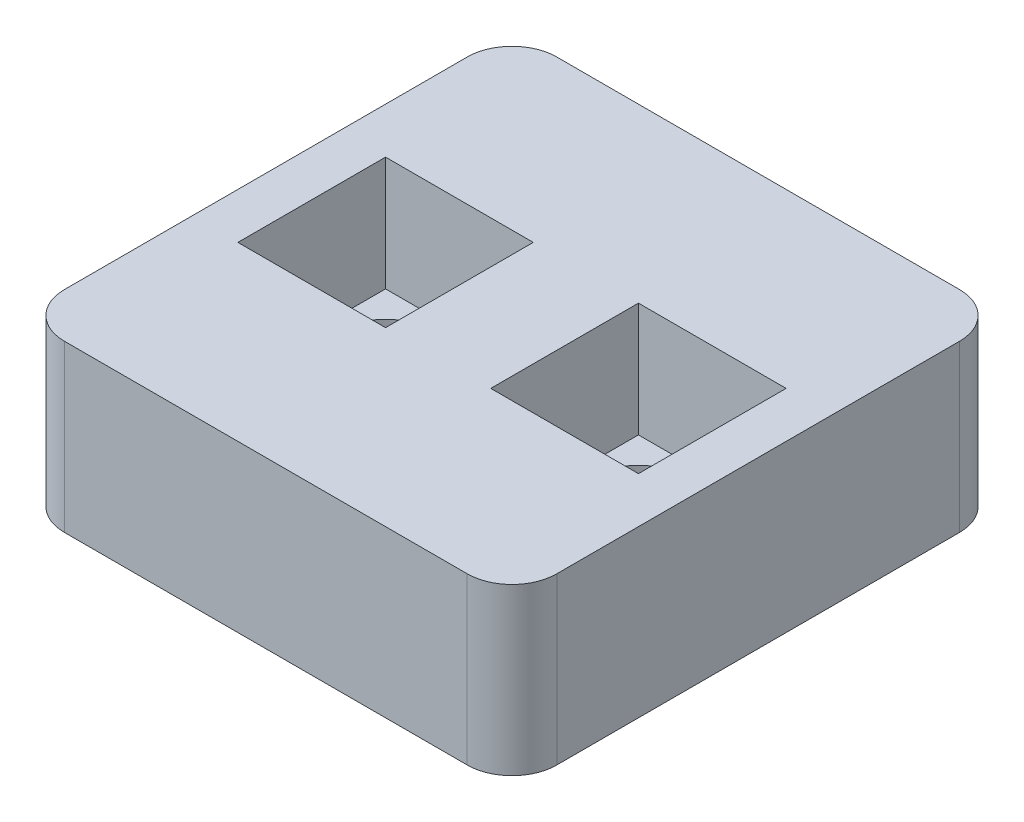
ISO-10303-21;
HEADER;
FILE_DESCRIPTION(('STEP AP214'),'2;1');
FILE_NAME('part.step','',(''),(''),'','','');
FILE_SCHEMA(('AUTOMOTIVE_DESIGN { 1 0 10303 214 1 1 1 1 }'));
ENDSEC;
DATA;
#1=APPLICATION_CONTEXT('core data for automotive mechanical design processes');
#2=APPLICATION_PROTOCOL_DEFINITION('international standard','automotive_design',2000,#1);
#3=PRODUCT_CONTEXT('',#1,'mechanical');
#4=PRODUCT('Part','Part','',(#3));
#5=PRODUCT_RELATED_PRODUCT_CATEGORY('part','',(#4));
#6=PRODUCT_DEFINITION_FORMATION('','',#4);
#7=PRODUCT_DEFINITION_CONTEXT('part definition',#1,'design');
#8=PRODUCT_DEFINITION('design','',#6,#7);
#9=PRODUCT_DEFINITION_SHAPE('','',#8);
#10=(LENGTH_UNIT() NAMED_UNIT(*) SI_UNIT(.MILLI.,.METRE.));
#11=(NAMED_UNIT(*) PLANE_ANGLE_UNIT() SI_UNIT($,.RADIAN.));
#12=(NAMED_UNIT(*) SI_UNIT($,.STERADIAN.) SOLID_ANGLE_UNIT());
#13=UNCERTAINTY_MEASURE_WITH_UNIT(LENGTH_MEASURE(1.E-05),#10,'distance_accuracy_value','');
#14=(GEOMETRIC_REPRESENTATION_CONTEXT(3) GLOBAL_UNCERTAINTY_ASSIGNED_CONTEXT((#13)) GLOBAL_UNIT_ASSIGNED_CONTEXT((#10,
#11,#12)) REPRESENTATION_CONTEXT('',''));
#15=CARTESIAN_POINT('',(0.,0.,0.));
#16=DIRECTION('',(0.,0.,1.));
#17=DIRECTION('',(1.,0.,0.));
#18=AXIS2_PLACEMENT_3D('',#15,#16,#17);
#19=CARTESIAN_POINT('',(5.5,3.7,5.5));
#20=DIRECTION('',(-1.,0.,0.));
#21=DIRECTION('',(0.,0.,1.));
#22=AXIS2_PLACEMENT_3D('',#19,#20,#21);
#23=PLANE('',#22);
#24=DIRECTION('',(0.,0.,-1.));
#25=VECTOR('',#24,1.);
#26=CARTESIAN_POINT('',(5.5,0.,5.5));
#27=LINE('',#26,#25);
#28=CARTESIAN_POINT('',(5.5,0.,4.5));
#29=VERTEX_POINT('',#28);
#30=CARTESIAN_POINT('',(5.5,0.,-4.5));
#31=VERTEX_POINT('',#30);
#32=EDGE_CURVE('E208',#29,#31,#27,.T.);
#33=ORIENTED_EDGE('',*,*,#32,.T.);
#34=DIRECTION('',(0.,-1.,0.));
#35=VECTOR('',#34,1.);
#36=CARTESIAN_POINT('',(5.5,3.7,-4.5));
#37=LINE('',#36,#35);
#38=CARTESIAN_POINT('',(5.5,3.7,-4.5));
#39=VERTEX_POINT('',#38);
#40=EDGE_CURVE('E11',#31,#39,#37,.F.);
#41=ORIENTED_EDGE('',*,*,#40,.T.);
#42=DIRECTION('',(0.,0.,-1.));
#43=VECTOR('',#42,1.);
#44=CARTESIAN_POINT('',(5.5,3.7,5.5));
#45=LINE('',#44,#43);
#46=CARTESIAN_POINT('',(5.5,3.7,4.5));
#47=VERTEX_POINT('',#46);
#48=EDGE_CURVE('E256',#47,#39,#45,.T.);
#49=ORIENTED_EDGE('',*,*,#48,.F.);
#50=DIRECTION('',(0.,-1.,0.));
#51=VECTOR('',#50,1.);
#52=CARTESIAN_POINT('',(5.5,3.7,4.5));
#53=LINE('',#52,#51);
#54=EDGE_CURVE('E55',#47,#29,#53,.T.);
#55=ORIENTED_EDGE('',*,*,#54,.T.);
#56=EDGE_LOOP('',(#33,#41,#49,#55));
#57=FACE_BOUND('',#56,.T.);
#58=ADVANCED_FACE('F45',(#57),#23,.F.);
#59=CARTESIAN_POINT('',(-5.5,3.7,-5.5));
#60=DIRECTION('',(0.,0.,1.));
#61=DIRECTION('',(1.,0.,0.));
#62=AXIS2_PLACEMENT_3D('',#59,#60,#61);
#63=PLANE('',#62);
#64=DIRECTION('',(-1.,0.,0.));
#65=VECTOR('',#64,1.);
#66=CARTESIAN_POINT('',(-5.5,0.,-5.5));
#67=LINE('',#66,#65);
#68=CARTESIAN_POINT('',(4.5,0.,-5.5));
#69=VERTEX_POINT('',#68);
#70=CARTESIAN_POINT('',(-4.5,0.,-5.5));
#71=VERTEX_POINT('',#70);
#72=EDGE_CURVE('E277',#69,#71,#67,.T.);
#73=ORIENTED_EDGE('',*,*,#72,.T.);
#74=DIRECTION('',(0.,-1.,0.));
#75=VECTOR('',#74,1.);
#76=CARTESIAN_POINT('',(-4.5,3.7,-5.5));
#77=LINE('',#76,#75);
#78=CARTESIAN_POINT('',(-4.5,3.7,-5.5));
#79=VERTEX_POINT('',#78);
#80=EDGE_CURVE('E310',#71,#79,#77,.F.);
#81=ORIENTED_EDGE('',*,*,#80,.T.);
#82=DIRECTION('',(-1.,0.,0.));
#83=VECTOR('',#82,1.);
#84=CARTESIAN_POINT('',(-5.5,3.7,-5.5));
#85=LINE('',#84,#83);
#86=CARTESIAN_POINT('',(4.5,3.7,-5.5));
#87=VERTEX_POINT('',#86);
#88=EDGE_CURVE('E260',#87,#79,#85,.T.);
#89=ORIENTED_EDGE('',*,*,#88,.F.);
#90=DIRECTION('',(0.,-1.,0.));
#91=VECTOR('',#90,1.);
#92=CARTESIAN_POINT('',(4.5,3.7,-5.5));
#93=LINE('',#92,#91);
#94=EDGE_CURVE('E306',#87,#69,#93,.T.);
#95=ORIENTED_EDGE('',*,*,#94,.T.);
#96=EDGE_LOOP('',(#73,#81,#89,#95));
#97=FACE_BOUND('',#96,.T.);
#98=ADVANCED_FACE('F417',(#97),#63,.F.);
#99=CARTESIAN_POINT('',(-5.5,3.7,5.5));
#100=DIRECTION('',(1.,0.,0.));
#101=DIRECTION('',(0.,0.,-1.));
#102=AXIS2_PLACEMENT_3D('',#99,#100,#101);
#103=PLANE('',#102);
#104=DIRECTION('',(0.,0.,1.));
#105=VECTOR('',#104,1.);
#106=CARTESIAN_POINT('',(-5.5,3.7,5.5));
#107=LINE('',#106,#105);
#108=CARTESIAN_POINT('',(-5.5,3.7,-4.5));
#109=VERTEX_POINT('',#108);
#110=CARTESIAN_POINT('',(-5.5,3.7,4.5));
#111=VERTEX_POINT('',#110);
#112=EDGE_CURVE('E265',#109,#111,#107,.T.);
#113=ORIENTED_EDGE('',*,*,#112,.F.);
#114=DIRECTION('',(0.,-1.,0.));
#115=VECTOR('',#114,1.);
#116=CARTESIAN_POINT('',(-5.5,3.7,-4.5));
#117=LINE('',#116,#115);
#118=CARTESIAN_POINT('',(-5.5,0.,-4.5));
#119=VERTEX_POINT('',#118);
#120=EDGE_CURVE('E290',#109,#119,#117,.T.);
#121=ORIENTED_EDGE('',*,*,#120,.T.);
#122=DIRECTION('',(0.,0.,1.));
#123=VECTOR('',#122,1.);
#124=CARTESIAN_POINT('',(-5.5,0.,5.5));
#125=LINE('',#124,#123);
#126=CARTESIAN_POINT('',(-5.5,0.,4.5));
#127=VERTEX_POINT('',#126);
#128=EDGE_CURVE('E281',#119,#127,#125,.T.);
#129=ORIENTED_EDGE('',*,*,#128,.T.);
#130=DIRECTION('',(0.,-1.,0.));
#131=VECTOR('',#130,1.);
#132=CARTESIAN_POINT('',(-5.5,3.7,4.5));
#133=LINE('',#132,#131);
#134=EDGE_CURVE('E273',#127,#111,#133,.F.);
#135=ORIENTED_EDGE('',*,*,#134,.T.);
#136=EDGE_LOOP('',(#113,#121,#129,#135));
#137=FACE_BOUND('',#136,.T.);
#138=ADVANCED_FACE('F397',(#137),#103,.F.);
#139=CARTESIAN_POINT('',(-5.5,3.7,5.5));
#140=DIRECTION('',(0.,0.,-1.));
#141=DIRECTION('',(-1.,0.,0.));
#142=AXIS2_PLACEMENT_3D('',#139,#140,#141);
#143=PLANE('',#142);
#144=DIRECTION('',(1.,0.,0.));
#145=VECTOR('',#144,1.);
#146=CARTESIAN_POINT('',(-5.5,3.7,5.5));
#147=LINE('',#146,#145);
#148=CARTESIAN_POINT('',(-4.5,3.7,5.5));
#149=VERTEX_POINT('',#148);
#150=CARTESIAN_POINT('',(4.5,3.7,5.5));
#151=VERTEX_POINT('',#150);
#152=EDGE_CURVE('E269',#149,#151,#147,.T.);
#153=ORIENTED_EDGE('',*,*,#152,.F.);
#154=DIRECTION('',(0.,-1.,0.));
#155=VECTOR('',#154,1.);
#156=CARTESIAN_POINT('',(-4.5,3.7,5.5));
#157=LINE('',#156,#155);
#158=CARTESIAN_POINT('',(-4.5,0.,5.5));
#159=VERTEX_POINT('',#158);
#160=EDGE_CURVE('E328',#149,#159,#157,.T.);
#161=ORIENTED_EDGE('',*,*,#160,.T.);
#162=DIRECTION('',(1.,0.,0.));
#163=VECTOR('',#162,1.);
#164=CARTESIAN_POINT('',(-5.5,0.,5.5));
#165=LINE('',#164,#163);
#166=CARTESIAN_POINT('',(4.5,0.,5.5));
#167=VERTEX_POINT('',#166);
#168=EDGE_CURVE('E261',#159,#167,#165,.T.);
#169=ORIENTED_EDGE('',*,*,#168,.T.);
#170=DIRECTION('',(0.,-1.,0.));
#171=VECTOR('',#170,1.);
#172=CARTESIAN_POINT('',(4.5,3.7,5.5));
#173=LINE('',#172,#171);
#174=EDGE_CURVE('E325',#167,#151,#173,.F.);
#175=ORIENTED_EDGE('',*,*,#174,.T.);
#176=EDGE_LOOP('',(#153,#161,#169,#175));
#177=FACE_BOUND('',#176,.T.);
#178=ADVANCED_FACE('F382',(#177),#143,.F.);
#179=CARTESIAN_POINT('',(0.,3.7,0.));
#180=DIRECTION('',(0.,-1.,0.));
#181=DIRECTION('',(0.,0.,-1.));
#182=AXIS2_PLACEMENT_3D('',#179,#180,#181);
#183=PLANE('',#182);
#184=DIRECTION('',(-1.,0.,0.));
#185=VECTOR('',#184,1.);
#186=CARTESIAN_POINT('',(-4.475,3.7,-1.65));
#187=LINE('',#186,#185);
#188=CARTESIAN_POINT('',(-1.175,3.7,-1.65));
#189=VERTEX_POINT('',#188);
#190=CARTESIAN_POINT('',(-4.475,3.7,-1.65));
#191=VERTEX_POINT('',#190);
#192=EDGE_CURVE('E199',#189,#191,#187,.T.);
#193=ORIENTED_EDGE('',*,*,#192,.F.);
#194=DIRECTION('',(0.,0.,-1.));
#195=VECTOR('',#194,1.);
#196=CARTESIAN_POINT('',(-1.175,3.7,1.65));
#197=LINE('',#196,#195);
#198=CARTESIAN_POINT('',(-1.175,3.7,1.65));
#199=VERTEX_POINT('',#198);
#200=EDGE_CURVE('E63',#199,#189,#197,.T.);
#201=ORIENTED_EDGE('',*,*,#200,.F.);
#202=DIRECTION('',(1.,0.,0.));
#203=VECTOR('',#202,1.);
#204=CARTESIAN_POINT('',(-4.475,3.7,1.65));
#205=LINE('',#204,#203);
#206=CARTESIAN_POINT('',(-4.475,3.7,1.65));
#207=VERTEX_POINT('',#206);
#208=EDGE_CURVE('E183',#207,#199,#205,.T.);
#209=ORIENTED_EDGE('',*,*,#208,.F.);
#210=DIRECTION('',(0.,0.,1.));
#211=VECTOR('',#210,1.);
#212=CARTESIAN_POINT('',(-4.475,3.7,1.65));
#213=LINE('',#212,#211);
#214=EDGE_CURVE('E187',#191,#207,#213,.T.);
#215=ORIENTED_EDGE('',*,*,#214,.F.);
#216=EDGE_LOOP('',(#193,#201,#209,#215));
#217=FACE_BOUND('',#216,.T.);
#218=DIRECTION('',(-1.,0.,0.));
#219=VECTOR('',#218,1.);
#220=CARTESIAN_POINT('',(1.175,3.7,-1.65));
#221=LINE('',#220,#219);
#222=CARTESIAN_POINT('',(4.475,3.7,-1.65));
#223=VERTEX_POINT('',#222);
#224=CARTESIAN_POINT('',(1.175,3.7,-1.65));
#225=VERTEX_POINT('',#224);
#226=EDGE_CURVE('E236',#223,#225,#221,.T.);
#227=ORIENTED_EDGE('',*,*,#226,.F.);
#228=DIRECTION('',(0.,0.,-1.));
#229=VECTOR('',#228,1.);
#230=CARTESIAN_POINT('',(4.475,3.7,1.65));
#231=LINE('',#230,#229);
#232=CARTESIAN_POINT('',(4.475,3.7,1.65));
#233=VERTEX_POINT('',#232);
#234=EDGE_CURVE('E71',#233,#223,#231,.T.);
#235=ORIENTED_EDGE('',*,*,#234,.F.);
#236=DIRECTION('',(1.,0.,0.));
#237=VECTOR('',#236,1.);
#238=CARTESIAN_POINT('',(1.175,3.7,1.65));
#239=LINE('',#238,#237);
#240=CARTESIAN_POINT('',(1.175,3.7,1.65));
#241=VERTEX_POINT('',#240);
#242=EDGE_CURVE('E227',#241,#233,#239,.T.);
#243=ORIENTED_EDGE('',*,*,#242,.F.);
#244=DIRECTION('',(0.,0.,1.));
#245=VECTOR('',#244,1.);
#246=CARTESIAN_POINT('',(1.175,3.7,1.65));
#247=LINE('',#246,#245);
#248=EDGE_CURVE('E231',#225,#241,#247,.T.);
#249=ORIENTED_EDGE('',*,*,#248,.F.);
#250=EDGE_LOOP('',(#227,#235,#243,#249));
#251=FACE_BOUND('',#250,.T.);
#252=ORIENTED_EDGE('',*,*,#88,.T.);
#253=CARTESIAN_POINT('',(-4.5,3.7,-4.5));
#254=DIRECTION('',(0.,-1.,0.));
#255=DIRECTION('',(0.,0.,-1.));
#256=AXIS2_PLACEMENT_3D('',#253,#254,#255);
#257=CIRCLE('',#256,1.);
#258=EDGE_CURVE('E322',#79,#109,#257,.F.);
#259=ORIENTED_EDGE('',*,*,#258,.T.);
#260=ORIENTED_EDGE('',*,*,#112,.T.);
#261=CARTESIAN_POINT('',(-4.5,3.7,4.5));
#262=DIRECTION('',(0.,-1.,0.));
#263=DIRECTION('',(0.,0.,-1.));
#264=AXIS2_PLACEMENT_3D('',#261,#262,#263);
#265=CIRCLE('',#264,1.);
#266=EDGE_CURVE('E319',#111,#149,#265,.F.);
#267=ORIENTED_EDGE('',*,*,#266,.T.);
#268=ORIENTED_EDGE('',*,*,#152,.T.);
#269=CARTESIAN_POINT('',(4.5,3.7,4.5));
#270=DIRECTION('',(0.,-1.,0.));
#271=DIRECTION('',(0.,0.,-1.));
#272=AXIS2_PLACEMENT_3D('',#269,#270,#271);
#273=CIRCLE('',#272,1.);
#274=EDGE_CURVE('E313',#151,#47,#273,.F.);
#275=ORIENTED_EDGE('',*,*,#274,.T.);
#276=ORIENTED_EDGE('',*,*,#48,.T.);
#277=CARTESIAN_POINT('',(4.5,3.7,-4.5));
#278=DIRECTION('',(0.,-1.,0.));
#279=DIRECTION('',(0.,0.,-1.));
#280=AXIS2_PLACEMENT_3D('',#277,#278,#279);
#281=CIRCLE('',#280,1.);
#282=EDGE_CURVE('E316',#39,#87,#281,.F.);
#283=ORIENTED_EDGE('',*,*,#282,.T.);
#284=EDGE_LOOP('',(#252,#259,#260,#267,#268,#275,#276,#283));
#285=FACE_BOUND('',#284,.T.);
#286=ADVANCED_FACE('F379',(#217,#251,#285),#183,.F.);
#287=CARTESIAN_POINT('',(0.,0.,0.));
#288=DIRECTION('',(0.,-1.,0.));
#289=DIRECTION('',(0.,0.,-1.));
#290=AXIS2_PLACEMENT_3D('',#287,#288,#289);
#291=PLANE('',#290);
#292=CARTESIAN_POINT('',(-2.825,0.,0.));
#293=DIRECTION('',(0.,1.,0.));
#294=DIRECTION('',(0.,0.,1.));
#295=AXIS2_PLACEMENT_3D('',#292,#293,#294);
#296=CIRCLE('',#295,1.5);
#297=CARTESIAN_POINT('',(-2.825,0.,1.5));
#298=VERTEX_POINT('',#297);
#299=EDGE_CURVE('E337',#298,#298,#296,.T.);
#300=ORIENTED_EDGE('',*,*,#299,.T.);
#301=EDGE_LOOP('',(#300));
#302=FACE_BOUND('',#301,.T.);
#303=CARTESIAN_POINT('',(2.825,0.,0.));
#304=DIRECTION('',(0.,1.,0.));
#305=DIRECTION('',(0.,0.,1.));
#306=AXIS2_PLACEMENT_3D('',#303,#304,#305);
#307=CIRCLE('',#306,1.5);
#308=CARTESIAN_POINT('',(2.825,0.,1.5));
#309=VERTEX_POINT('',#308);
#310=EDGE_CURVE('E190',#309,#309,#307,.T.);
#311=ORIENTED_EDGE('',*,*,#310,.T.);
#312=EDGE_LOOP('',(#311));
#313=FACE_BOUND('',#312,.T.);
#314=ORIENTED_EDGE('',*,*,#128,.F.);
#315=CARTESIAN_POINT('',(-4.5,0.,-4.5));
#316=DIRECTION('',(0.,-1.,0.));
#317=DIRECTION('',(0.,0.,-1.));
#318=AXIS2_PLACEMENT_3D('',#315,#316,#317);
#319=CIRCLE('',#318,1.);
#320=EDGE_CURVE('E303',#119,#71,#319,.T.);
#321=ORIENTED_EDGE('',*,*,#320,.T.);
#322=ORIENTED_EDGE('',*,*,#72,.F.);
#323=CARTESIAN_POINT('',(4.5,0.,-4.5));
#324=DIRECTION('',(0.,-1.,0.));
#325=DIRECTION('',(0.,0.,-1.));
#326=AXIS2_PLACEMENT_3D('',#323,#324,#325);
#327=CIRCLE('',#326,1.);
#328=EDGE_CURVE('E297',#69,#31,#327,.T.);
#329=ORIENTED_EDGE('',*,*,#328,.T.);
#330=ORIENTED_EDGE('',*,*,#32,.F.);
#331=CARTESIAN_POINT('',(4.5,0.,4.5));
#332=DIRECTION('',(0.,-1.,0.));
#333=DIRECTION('',(0.,0.,-1.));
#334=AXIS2_PLACEMENT_3D('',#331,#332,#333);
#335=CIRCLE('',#334,1.);
#336=EDGE_CURVE('E294',#29,#167,#335,.T.);
#337=ORIENTED_EDGE('',*,*,#336,.T.);
#338=ORIENTED_EDGE('',*,*,#168,.F.);
#339=CARTESIAN_POINT('',(-4.5,0.,4.5));
#340=DIRECTION('',(0.,-1.,0.));
#341=DIRECTION('',(0.,0.,-1.));
#342=AXIS2_PLACEMENT_3D('',#339,#340,#341);
#343=CIRCLE('',#342,1.);
#344=EDGE_CURVE('E300',#159,#127,#343,.T.);
#345=ORIENTED_EDGE('',*,*,#344,.T.);
#346=EDGE_LOOP('',(#314,#321,#322,#329,#330,#337,#338,#345));
#347=FACE_BOUND('',#346,.T.);
#348=ADVANCED_FACE('F350',(#302,#313,#347),#291,.T.);
#349=CARTESIAN_POINT('',(-4.5,3.7,-4.5));
#350=DIRECTION('',(0.,-1.,0.));
#351=DIRECTION('',(0.,0.,-1.));
#352=AXIS2_PLACEMENT_3D('',#349,#350,#351);
#353=CYLINDRICAL_SURFACE('',#352,1.);
#354=ORIENTED_EDGE('',*,*,#258,.F.);
#355=ORIENTED_EDGE('',*,*,#80,.F.);
#356=ORIENTED_EDGE('',*,*,#320,.F.);
#357=ORIENTED_EDGE('',*,*,#120,.F.);
#358=EDGE_LOOP('',(#354,#355,#356,#357));
#359=FACE_BOUND('',#358,.T.);
#360=ADVANCED_FACE('F394',(#359),#353,.T.);
#361=CARTESIAN_POINT('',(-4.5,3.7,4.5));
#362=DIRECTION('',(0.,-1.,0.));
#363=DIRECTION('',(0.,0.,-1.));
#364=AXIS2_PLACEMENT_3D('',#361,#362,#363);
#365=CYLINDRICAL_SURFACE('',#364,1.);
#366=ORIENTED_EDGE('',*,*,#266,.F.);
#367=ORIENTED_EDGE('',*,*,#134,.F.);
#368=ORIENTED_EDGE('',*,*,#344,.F.);
#369=ORIENTED_EDGE('',*,*,#160,.F.);
#370=EDGE_LOOP('',(#366,#367,#368,#369));
#371=FACE_BOUND('',#370,.T.);
#372=ADVANCED_FACE('F404',(#371),#365,.T.);
#373=CARTESIAN_POINT('',(4.5,3.7,-4.5));
#374=DIRECTION('',(0.,-1.,0.));
#375=DIRECTION('',(0.,0.,-1.));
#376=AXIS2_PLACEMENT_3D('',#373,#374,#375);
#377=CYLINDRICAL_SURFACE('',#376,1.);
#378=ORIENTED_EDGE('',*,*,#282,.F.);
#379=ORIENTED_EDGE('',*,*,#40,.F.);
#380=ORIENTED_EDGE('',*,*,#328,.F.);
#381=ORIENTED_EDGE('',*,*,#94,.F.);
#382=EDGE_LOOP('',(#378,#379,#380,#381));
#383=FACE_BOUND('',#382,.T.);
#384=ADVANCED_FACE('F416',(#383),#377,.T.);
#385=CARTESIAN_POINT('',(4.5,3.7,4.5));
#386=DIRECTION('',(0.,-1.,0.));
#387=DIRECTION('',(0.,0.,-1.));
#388=AXIS2_PLACEMENT_3D('',#385,#386,#387);
#389=CYLINDRICAL_SURFACE('',#388,1.);
#390=ORIENTED_EDGE('',*,*,#274,.F.);
#391=ORIENTED_EDGE('',*,*,#174,.F.);
#392=ORIENTED_EDGE('',*,*,#336,.F.);
#393=ORIENTED_EDGE('',*,*,#54,.F.);
#394=EDGE_LOOP('',(#390,#391,#392,#393));
#395=FACE_BOUND('',#394,.T.);
#396=ADVANCED_FACE('F47',(#395),#389,.T.);
#397=CARTESIAN_POINT('',(4.475,1.15,1.65));
#398=DIRECTION('',(1.,0.,0.));
#399=DIRECTION('',(0.,0.,-1.));
#400=AXIS2_PLACEMENT_3D('',#397,#398,#399);
#401=PLANE('',#400);
#402=ORIENTED_EDGE('',*,*,#234,.T.);
#403=DIRECTION('',(0.,1.,0.));
#404=VECTOR('',#403,1.);
#405=CARTESIAN_POINT('',(4.475,1.15,-1.65));
#406=LINE('',#405,#404);
#407=CARTESIAN_POINT('',(4.475,1.15,-1.65));
#408=VERTEX_POINT('',#407);
#409=EDGE_CURVE('E214',#408,#223,#406,.T.);
#410=ORIENTED_EDGE('',*,*,#409,.F.);
#411=DIRECTION('',(0.,0.,-1.));
#412=VECTOR('',#411,1.);
#413=CARTESIAN_POINT('',(4.475,1.15,1.65));
#414=LINE('',#413,#412);
#415=CARTESIAN_POINT('',(4.475,1.15,1.65));
#416=VERTEX_POINT('',#415);
#417=EDGE_CURVE('E232',#416,#408,#414,.T.);
#418=ORIENTED_EDGE('',*,*,#417,.F.);
#419=DIRECTION('',(0.,1.,0.));
#420=VECTOR('',#419,1.);
#421=CARTESIAN_POINT('',(4.475,1.15,1.65));
#422=LINE('',#421,#420);
#423=EDGE_CURVE('E224',#416,#233,#422,.T.);
#424=ORIENTED_EDGE('',*,*,#423,.T.);
#425=EDGE_LOOP('',(#402,#410,#418,#424));
#426=FACE_BOUND('',#425,.T.);
#427=ADVANCED_FACE('F368',(#426),#401,.F.);
#428=CARTESIAN_POINT('',(1.175,1.15,1.65));
#429=DIRECTION('',(0.,0.,1.));
#430=DIRECTION('',(1.,0.,0.));
#431=AXIS2_PLACEMENT_3D('',#428,#429,#430);
#432=PLANE('',#431);
#433=ORIENTED_EDGE('',*,*,#242,.T.);
#434=ORIENTED_EDGE('',*,*,#423,.F.);
#435=DIRECTION('',(1.,0.,0.));
#436=VECTOR('',#435,1.);
#437=CARTESIAN_POINT('',(1.175,1.15,1.65));
#438=LINE('',#437,#436);
#439=CARTESIAN_POINT('',(1.175,1.15,1.65));
#440=VERTEX_POINT('',#439);
#441=EDGE_CURVE('E217',#440,#416,#438,.T.);
#442=ORIENTED_EDGE('',*,*,#441,.F.);
#443=DIRECTION('',(0.,1.,0.));
#444=VECTOR('',#443,1.);
#445=CARTESIAN_POINT('',(1.175,1.15,1.65));
#446=LINE('',#445,#444);
#447=EDGE_CURVE('E221',#440,#241,#446,.T.);
#448=ORIENTED_EDGE('',*,*,#447,.T.);
#449=EDGE_LOOP('',(#433,#434,#442,#448));
#450=FACE_BOUND('',#449,.T.);
#451=ADVANCED_FACE('F376',(#450),#432,.F.);
#452=CARTESIAN_POINT('',(1.175,1.15,1.65));
#453=DIRECTION('',(-1.,0.,0.));
#454=DIRECTION('',(0.,0.,1.));
#455=AXIS2_PLACEMENT_3D('',#452,#453,#454);
#456=PLANE('',#455);
#457=ORIENTED_EDGE('',*,*,#248,.T.);
#458=ORIENTED_EDGE('',*,*,#447,.F.);
#459=DIRECTION('',(0.,0.,1.));
#460=VECTOR('',#459,1.);
#461=CARTESIAN_POINT('',(1.175,1.15,1.65));
#462=LINE('',#461,#460);
#463=CARTESIAN_POINT('',(1.175,1.15,-1.65));
#464=VERTEX_POINT('',#463);
#465=EDGE_CURVE('E245',#464,#440,#462,.T.);
#466=ORIENTED_EDGE('',*,*,#465,.F.);
#467=DIRECTION('',(0.,1.,0.));
#468=VECTOR('',#467,1.);
#469=CARTESIAN_POINT('',(1.175,1.15,-1.65));
#470=LINE('',#469,#468);
#471=EDGE_CURVE('E218',#464,#225,#470,.T.);
#472=ORIENTED_EDGE('',*,*,#471,.T.);
#473=EDGE_LOOP('',(#457,#458,#466,#472));
#474=FACE_BOUND('',#473,.T.);
#475=ADVANCED_FACE('F374',(#474),#456,.F.);
#476=CARTESIAN_POINT('',(1.175,1.15,-1.65));
#477=DIRECTION('',(0.,0.,-1.));
#478=DIRECTION('',(-1.,0.,0.));
#479=AXIS2_PLACEMENT_3D('',#476,#477,#478);
#480=PLANE('',#479);
#481=ORIENTED_EDGE('',*,*,#226,.T.);
#482=ORIENTED_EDGE('',*,*,#471,.F.);
#483=DIRECTION('',(-1.,0.,0.));
#484=VECTOR('',#483,1.);
#485=CARTESIAN_POINT('',(1.175,1.15,-1.65));
#486=LINE('',#485,#484);
#487=EDGE_CURVE('E249',#408,#464,#486,.T.);
#488=ORIENTED_EDGE('',*,*,#487,.F.);
#489=ORIENTED_EDGE('',*,*,#409,.T.);
#490=EDGE_LOOP('',(#481,#482,#488,#489));
#491=FACE_BOUND('',#490,.T.);
#492=ADVANCED_FACE('F363',(#491),#480,.F.);
#493=CARTESIAN_POINT('',(0.,1.15,0.));
#494=DIRECTION('',(0.,-1.,0.));
#495=DIRECTION('',(0.,0.,-1.));
#496=AXIS2_PLACEMENT_3D('',#493,#494,#495);
#497=PLANE('',#496);
#498=CARTESIAN_POINT('',(2.825,1.15,0.));
#499=DIRECTION('',(0.,-1.,0.));
#500=DIRECTION('',(0.,0.,-1.));
#501=AXIS2_PLACEMENT_3D('',#498,#499,#500);
#502=CIRCLE('',#501,1.5);
#503=CARTESIAN_POINT('',(2.825,1.15,-1.5));
#504=VERTEX_POINT('',#503);
#505=EDGE_CURVE('E49',#504,#504,#502,.T.);
#506=ORIENTED_EDGE('',*,*,#505,.T.);
#507=EDGE_LOOP('',(#506));
#508=FACE_BOUND('',#507,.T.);
#509=ORIENTED_EDGE('',*,*,#417,.T.);
#510=ORIENTED_EDGE('',*,*,#487,.T.);
#511=ORIENTED_EDGE('',*,*,#465,.T.);
#512=ORIENTED_EDGE('',*,*,#441,.T.);
#513=EDGE_LOOP('',(#509,#510,#511,#512));
#514=FACE_BOUND('',#513,.T.);
#515=ADVANCED_FACE('F360',(#508,#514),#497,.F.);
#516=CARTESIAN_POINT('',(-1.175,1.15,1.65));
#517=DIRECTION('',(1.,0.,0.));
#518=DIRECTION('',(0.,0.,-1.));
#519=AXIS2_PLACEMENT_3D('',#516,#517,#518);
#520=PLANE('',#519);
#521=ORIENTED_EDGE('',*,*,#200,.T.);
#522=DIRECTION('',(0.,1.,0.));
#523=VECTOR('',#522,1.);
#524=CARTESIAN_POINT('',(-1.175,1.15,-1.65));
#525=LINE('',#524,#523);
#526=CARTESIAN_POINT('',(-1.175,1.15,-1.65));
#527=VERTEX_POINT('',#526);
#528=EDGE_CURVE('E158',#527,#189,#525,.T.);
#529=ORIENTED_EDGE('',*,*,#528,.F.);
#530=DIRECTION('',(0.,0.,-1.));
#531=VECTOR('',#530,1.);
#532=CARTESIAN_POINT('',(-1.175,1.15,1.65));
#533=LINE('',#532,#531);
#534=CARTESIAN_POINT('',(-1.175,1.15,1.65));
#535=VERTEX_POINT('',#534);
#536=EDGE_CURVE('E162',#535,#527,#533,.T.);
#537=ORIENTED_EDGE('',*,*,#536,.F.);
#538=DIRECTION('',(0.,1.,0.));
#539=VECTOR('',#538,1.);
#540=CARTESIAN_POINT('',(-1.175,1.15,1.65));
#541=LINE('',#540,#539);
#542=EDGE_CURVE('E205',#535,#199,#541,.T.);
#543=ORIENTED_EDGE('',*,*,#542,.T.);
#544=EDGE_LOOP('',(#521,#529,#537,#543));
#545=FACE_BOUND('',#544,.T.);
#546=ADVANCED_FACE('F160',(#545),#520,.F.);
#547=CARTESIAN_POINT('',(-4.475,1.15,1.65));
#548=DIRECTION('',(0.,0.,1.));
#549=DIRECTION('',(1.,0.,0.));
#550=AXIS2_PLACEMENT_3D('',#547,#548,#549);
#551=PLANE('',#550);
#552=ORIENTED_EDGE('',*,*,#208,.T.);
#553=ORIENTED_EDGE('',*,*,#542,.F.);
#554=DIRECTION('',(1.,0.,0.));
#555=VECTOR('',#554,1.);
#556=CARTESIAN_POINT('',(-4.475,1.15,1.65));
#557=LINE('',#556,#555);
#558=CARTESIAN_POINT('',(-4.475,1.15,1.65));
#559=VERTEX_POINT('',#558);
#560=EDGE_CURVE('E169',#559,#535,#557,.T.);
#561=ORIENTED_EDGE('',*,*,#560,.F.);
#562=DIRECTION('',(0.,1.,0.));
#563=VECTOR('',#562,1.);
#564=CARTESIAN_POINT('',(-4.475,1.15,1.65));
#565=LINE('',#564,#563);
#566=EDGE_CURVE('E209',#559,#207,#565,.T.);
#567=ORIENTED_EDGE('',*,*,#566,.T.);
#568=EDGE_LOOP('',(#552,#553,#561,#567));
#569=FACE_BOUND('',#568,.T.);
#570=ADVANCED_FACE('F531',(#569),#551,.F.);
#571=CARTESIAN_POINT('',(-4.475,1.15,1.65));
#572=DIRECTION('',(-1.,0.,0.));
#573=DIRECTION('',(0.,0.,1.));
#574=AXIS2_PLACEMENT_3D('',#571,#572,#573);
#575=PLANE('',#574);
#576=ORIENTED_EDGE('',*,*,#214,.T.);
#577=ORIENTED_EDGE('',*,*,#566,.F.);
#578=DIRECTION('',(0.,0.,1.));
#579=VECTOR('',#578,1.);
#580=CARTESIAN_POINT('',(-4.475,1.15,1.65));
#581=LINE('',#580,#579);
#582=CARTESIAN_POINT('',(-4.475,1.15,-1.65));
#583=VERTEX_POINT('',#582);
#584=EDGE_CURVE('E178',#583,#559,#581,.T.);
#585=ORIENTED_EDGE('',*,*,#584,.F.);
#586=DIRECTION('',(0.,1.,0.));
#587=VECTOR('',#586,1.);
#588=CARTESIAN_POINT('',(-4.475,1.15,-1.65));
#589=LINE('',#588,#587);
#590=EDGE_CURVE('E168',#583,#191,#589,.T.);
#591=ORIENTED_EDGE('',*,*,#590,.T.);
#592=EDGE_LOOP('',(#576,#577,#585,#591));
#593=FACE_BOUND('',#592,.T.);
#594=ADVANCED_FACE('F540',(#593),#575,.F.);
#595=CARTESIAN_POINT('',(-4.475,1.15,-1.65));
#596=DIRECTION('',(0.,0.,-1.));
#597=DIRECTION('',(-1.,0.,0.));
#598=AXIS2_PLACEMENT_3D('',#595,#596,#597);
#599=PLANE('',#598);
#600=ORIENTED_EDGE('',*,*,#192,.T.);
#601=ORIENTED_EDGE('',*,*,#590,.F.);
#602=DIRECTION('',(-1.,0.,0.));
#603=VECTOR('',#602,1.);
#604=CARTESIAN_POINT('',(-4.475,1.15,-1.65));
#605=LINE('',#604,#603);
#606=EDGE_CURVE('E172',#527,#583,#605,.T.);
#607=ORIENTED_EDGE('',*,*,#606,.F.);
#608=ORIENTED_EDGE('',*,*,#528,.T.);
#609=EDGE_LOOP('',(#600,#601,#607,#608));
#610=FACE_BOUND('',#609,.T.);
#611=ADVANCED_FACE('F173',(#610),#599,.F.);
#612=CARTESIAN_POINT('',(0.,1.15,0.));
#613=DIRECTION('',(0.,-1.,0.));
#614=DIRECTION('',(0.,0.,-1.));
#615=AXIS2_PLACEMENT_3D('',#612,#613,#614);
#616=PLANE('',#615);
#617=CARTESIAN_POINT('',(-2.825,1.15,0.));
#618=DIRECTION('',(0.,-1.,0.));
#619=DIRECTION('',(0.,0.,-1.));
#620=AXIS2_PLACEMENT_3D('',#617,#618,#619);
#621=CIRCLE('',#620,1.5);
#622=CARTESIAN_POINT('',(-2.825,1.15,-1.5));
#623=VERTEX_POINT('',#622);
#624=EDGE_CURVE('E334',#623,#623,#621,.T.);
#625=ORIENTED_EDGE('',*,*,#624,.T.);
#626=EDGE_LOOP('',(#625));
#627=FACE_BOUND('',#626,.T.);
#628=ORIENTED_EDGE('',*,*,#536,.T.);
#629=ORIENTED_EDGE('',*,*,#606,.T.);
#630=ORIENTED_EDGE('',*,*,#584,.T.);
#631=ORIENTED_EDGE('',*,*,#560,.T.);
#632=EDGE_LOOP('',(#628,#629,#630,#631));
#633=FACE_BOUND('',#632,.T.);
#634=ADVANCED_FACE('F180',(#627,#633),#616,.F.);
#635=CARTESIAN_POINT('',(-2.825,0.,0.));
#636=DIRECTION('',(0.,1.,0.));
#637=DIRECTION('',(0.,0.,1.));
#638=AXIS2_PLACEMENT_3D('',#635,#636,#637);
#639=CYLINDRICAL_SURFACE('',#638,1.5);
#640=ORIENTED_EDGE('',*,*,#299,.F.);
#641=EDGE_LOOP('',(#640));
#642=FACE_BOUND('',#641,.T.);
#643=ORIENTED_EDGE('',*,*,#624,.F.);
#644=EDGE_LOOP('',(#643));
#645=FACE_BOUND('',#644,.T.);
#646=ADVANCED_FACE('F356',(#642,#645),#639,.F.);
#647=CARTESIAN_POINT('',(2.825,0.,0.));
#648=DIRECTION('',(0.,1.,0.));
#649=DIRECTION('',(0.,0.,1.));
#650=AXIS2_PLACEMENT_3D('',#647,#648,#649);
#651=CYLINDRICAL_SURFACE('',#650,1.5);
#652=ORIENTED_EDGE('',*,*,#310,.F.);
#653=EDGE_LOOP('',(#652));
#654=FACE_BOUND('',#653,.T.);
#655=ORIENTED_EDGE('',*,*,#505,.F.);
#656=EDGE_LOOP('',(#655));
#657=FACE_BOUND('',#656,.T.);
#658=ADVANCED_FACE('F353',(#654,#657),#651,.F.);
#659=CLOSED_SHELL('',(#58,#98,#138,#178,#286,#348,#360,#372,#384,#396,#427,#451,#475,#492,#515,
#546,#570,#594,#611,#634,#646,#658));
#660=MANIFOLD_SOLID_BREP('B2',#659);
#661=ADVANCED_BREP_SHAPE_REPRESENTATION('',(#18,#660),#14);
#662=SHAPE_DEFINITION_REPRESENTATION(#9,#661);
ENDSEC;
END-ISO-10303-21;
